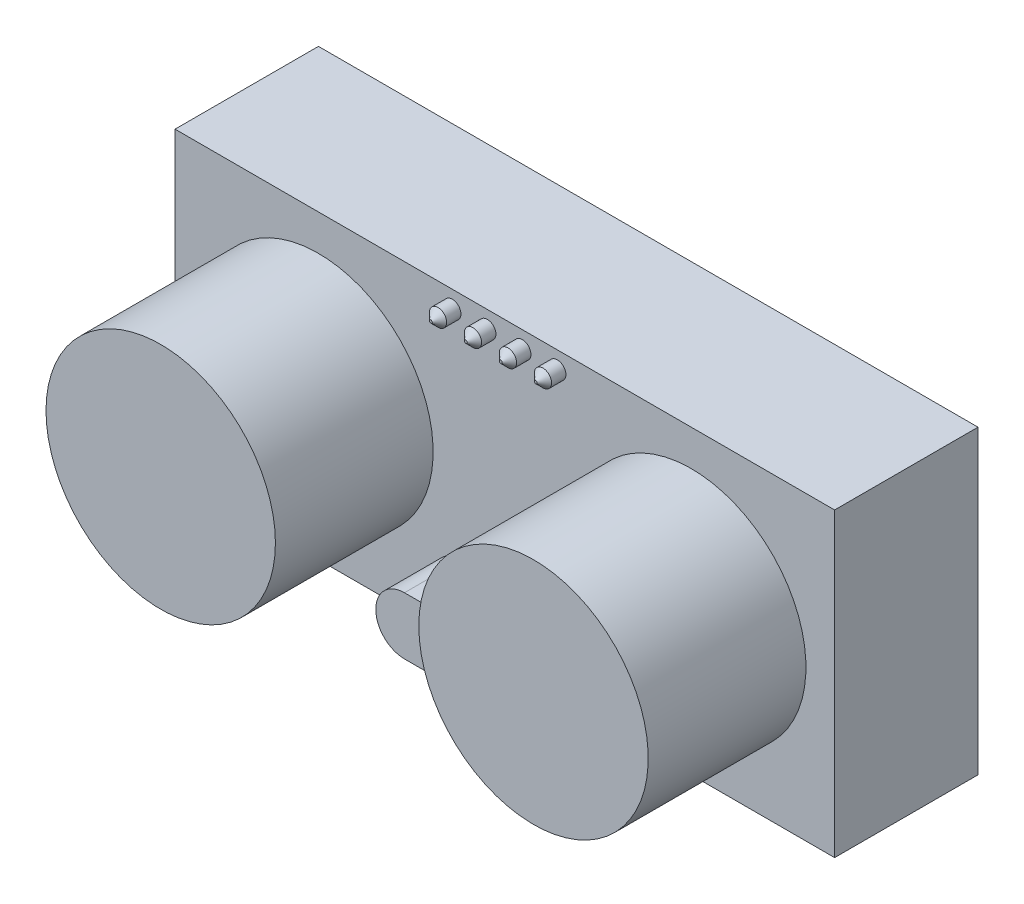
ISO-10303-21;
HEADER;
FILE_DESCRIPTION(('STEP AP214'),'2;1');
FILE_NAME('part.step','',(''),(''),'','','');
FILE_SCHEMA(('AUTOMOTIVE_DESIGN { 1 0 10303 214 1 1 1 1 }'));
ENDSEC;
DATA;
#1=APPLICATION_CONTEXT('core data for automotive mechanical design processes');
#2=APPLICATION_PROTOCOL_DEFINITION('international standard','automotive_design',2000,#1);
#3=PRODUCT_CONTEXT('',#1,'mechanical');
#4=PRODUCT('Part','Part','',(#3));
#5=PRODUCT_RELATED_PRODUCT_CATEGORY('part','',(#4));
#6=PRODUCT_DEFINITION_FORMATION('','',#4);
#7=PRODUCT_DEFINITION_CONTEXT('part definition',#1,'design');
#8=PRODUCT_DEFINITION('design','',#6,#7);
#9=PRODUCT_DEFINITION_SHAPE('','',#8);
#10=(LENGTH_UNIT() NAMED_UNIT(*) SI_UNIT(.MILLI.,.METRE.));
#11=(NAMED_UNIT(*) PLANE_ANGLE_UNIT() SI_UNIT($,.RADIAN.));
#12=(NAMED_UNIT(*) SI_UNIT($,.STERADIAN.) SOLID_ANGLE_UNIT());
#13=UNCERTAINTY_MEASURE_WITH_UNIT(LENGTH_MEASURE(1.E-05),#10,'distance_accuracy_value','');
#14=(GEOMETRIC_REPRESENTATION_CONTEXT(3) GLOBAL_UNCERTAINTY_ASSIGNED_CONTEXT((#13)) GLOBAL_UNIT_ASSIGNED_CONTEXT((#10,
#11,#12)) REPRESENTATION_CONTEXT('',''));
#15=CARTESIAN_POINT('',(0.,0.,0.));
#16=DIRECTION('',(0.,0.,1.));
#17=DIRECTION('',(1.,0.,0.));
#18=AXIS2_PLACEMENT_3D('',#15,#16,#17);
#19=CARTESIAN_POINT('',(0.,0.,10.));
#20=DIRECTION('',(0.,0.,-1.));
#21=DIRECTION('',(-1.,0.,0.));
#22=AXIS2_PLACEMENT_3D('',#19,#20,#21);
#23=PLANE('',#22);
#24=CARTESIAN_POINT('',(3.66,9.3,10.));
#25=DIRECTION('',(0.,0.,-1.));
#26=DIRECTION('',(-1.,0.,0.));
#27=AXIS2_PLACEMENT_3D('',#24,#25,#26);
#28=CIRCLE('',#27,0.6);
#29=CARTESIAN_POINT('',(3.06,9.3,10.));
#30=VERTEX_POINT('',#29);
#31=EDGE_CURVE('E172',#30,#30,#28,.F.);
#32=ORIENTED_EDGE('',*,*,#31,.F.);
#33=EDGE_LOOP('',(#32));
#34=FACE_BOUND('',#33,.T.);
#35=CARTESIAN_POINT('',(-3.66,9.29999999999999,10.));
#36=DIRECTION('',(0.,0.,-1.));
#37=DIRECTION('',(-1.,0.,0.));
#38=AXIS2_PLACEMENT_3D('',#35,#36,#37);
#39=CIRCLE('',#38,0.6);
#40=CARTESIAN_POINT('',(-4.26,9.29999999999999,10.));
#41=VERTEX_POINT('',#40);
#42=EDGE_CURVE('E166',#41,#41,#39,.F.);
#43=ORIENTED_EDGE('',*,*,#42,.F.);
#44=EDGE_LOOP('',(#43));
#45=FACE_BOUND('',#44,.T.);
#46=CARTESIAN_POINT('',(13.,0.,10.));
#47=DIRECTION('',(0.,0.,-1.));
#48=DIRECTION('',(-1.,0.,0.));
#49=AXIS2_PLACEMENT_3D('',#46,#47,#48);
#50=CIRCLE('',#49,8.);
#51=CARTESIAN_POINT('',(5.,0.,10.));
#52=VERTEX_POINT('',#51);
#53=EDGE_CURVE('E163',#52,#52,#50,.F.);
#54=ORIENTED_EDGE('',*,*,#53,.F.);
#55=EDGE_LOOP('',(#54));
#56=FACE_BOUND('',#55,.T.);
#57=DIRECTION('',(0.,1.,0.));
#58=VECTOR('',#57,1.);
#59=CARTESIAN_POINT('',(23.,-10.5,10.));
#60=LINE('',#59,#58);
#61=CARTESIAN_POINT('',(23.,-10.5,10.));
#62=VERTEX_POINT('',#61);
#63=CARTESIAN_POINT('',(23.,10.5,10.));
#64=VERTEX_POINT('',#63);
#65=EDGE_CURVE('E131',#62,#64,#60,.T.);
#66=ORIENTED_EDGE('',*,*,#65,.T.);
#67=DIRECTION('',(-1.,0.,0.));
#68=VECTOR('',#67,1.);
#69=CARTESIAN_POINT('',(-23.,10.5,10.));
#70=LINE('',#69,#68);
#71=CARTESIAN_POINT('',(-23.,10.5,10.));
#72=VERTEX_POINT('',#71);
#73=EDGE_CURVE('E134',#64,#72,#70,.T.);
#74=ORIENTED_EDGE('',*,*,#73,.T.);
#75=DIRECTION('',(0.,-1.,0.));
#76=VECTOR('',#75,1.);
#77=CARTESIAN_POINT('',(-23.,-10.5,10.));
#78=LINE('',#77,#76);
#79=CARTESIAN_POINT('',(-23.,-10.5,10.));
#80=VERTEX_POINT('',#79);
#81=EDGE_CURVE('E137',#72,#80,#78,.T.);
#82=ORIENTED_EDGE('',*,*,#81,.T.);
#83=DIRECTION('',(1.,0.,0.));
#84=VECTOR('',#83,1.);
#85=CARTESIAN_POINT('',(-23.,-10.5,10.));
#86=LINE('',#85,#84);
#87=EDGE_CURVE('E139',#80,#62,#86,.T.);
#88=ORIENTED_EDGE('',*,*,#87,.T.);
#89=EDGE_LOOP('',(#66,#74,#82,#88));
#90=FACE_BOUND('',#89,.T.);
#91=CARTESIAN_POINT('',(-13.,0.,10.));
#92=DIRECTION('',(0.,0.,-1.));
#93=DIRECTION('',(-1.,0.,0.));
#94=AXIS2_PLACEMENT_3D('',#91,#92,#93);
#95=CIRCLE('',#94,8.);
#96=CARTESIAN_POINT('',(-21.,0.,10.));
#97=VERTEX_POINT('',#96);
#98=EDGE_CURVE('E160',#97,#97,#95,.F.);
#99=ORIENTED_EDGE('',*,*,#98,.F.);
#100=EDGE_LOOP('',(#99));
#101=FACE_BOUND('',#100,.T.);
#102=CARTESIAN_POINT('',(-3.,-7.50000000000001,10.));
#103=DIRECTION('',(0.,0.,1.));
#104=DIRECTION('',(1.,0.,0.));
#105=AXIS2_PLACEMENT_3D('',#102,#103,#104);
#106=CIRCLE('',#105,2.);
#107=CARTESIAN_POINT('',(-3.,-5.50000000000001,10.));
#108=VERTEX_POINT('',#107);
#109=CARTESIAN_POINT('',(-3.,-9.50000000000001,10.));
#110=VERTEX_POINT('',#109);
#111=EDGE_CURVE('E118',#108,#110,#106,.T.);
#112=ORIENTED_EDGE('',*,*,#111,.F.);
#113=DIRECTION('',(-1.,0.,0.));
#114=VECTOR('',#113,1.);
#115=CARTESIAN_POINT('',(-3.,-5.50000000000001,10.));
#116=LINE('',#115,#114);
#117=CARTESIAN_POINT('',(3.,-5.50000000000001,10.));
#118=VERTEX_POINT('',#117);
#119=EDGE_CURVE('E115',#118,#108,#116,.T.);
#120=ORIENTED_EDGE('',*,*,#119,.F.);
#121=CARTESIAN_POINT('',(3.,-7.50000000000001,10.));
#122=DIRECTION('',(0.,0.,1.));
#123=DIRECTION('',(1.,0.,0.));
#124=AXIS2_PLACEMENT_3D('',#121,#122,#123);
#125=CIRCLE('',#124,2.);
#126=CARTESIAN_POINT('',(3.,-9.50000000000001,10.));
#127=VERTEX_POINT('',#126);
#128=EDGE_CURVE('E53',#127,#118,#125,.T.);
#129=ORIENTED_EDGE('',*,*,#128,.F.);
#130=DIRECTION('',(1.,0.,0.));
#131=VECTOR('',#130,1.);
#132=CARTESIAN_POINT('',(-3.,-9.50000000000001,10.));
#133=LINE('',#132,#131);
#134=EDGE_CURVE('E48',#110,#127,#133,.T.);
#135=ORIENTED_EDGE('',*,*,#134,.F.);
#136=EDGE_LOOP('',(#112,#120,#129,#135));
#137=FACE_BOUND('',#136,.T.);
#138=CARTESIAN_POINT('',(-1.22,9.29999999999999,10.));
#139=DIRECTION('',(0.,0.,-1.));
#140=DIRECTION('',(-1.,0.,0.));
#141=AXIS2_PLACEMENT_3D('',#138,#139,#140);
#142=CIRCLE('',#141,0.6);
#143=CARTESIAN_POINT('',(-1.82,9.29999999999999,10.));
#144=VERTEX_POINT('',#143);
#145=EDGE_CURVE('E169',#144,#144,#142,.F.);
#146=ORIENTED_EDGE('',*,*,#145,.F.);
#147=EDGE_LOOP('',(#146));
#148=FACE_BOUND('',#147,.T.);
#149=CARTESIAN_POINT('',(1.22,9.29999999999999,10.));
#150=DIRECTION('',(0.,0.,-1.));
#151=DIRECTION('',(-1.,0.,0.));
#152=AXIS2_PLACEMENT_3D('',#149,#150,#151);
#153=CIRCLE('',#152,0.6);
#154=CARTESIAN_POINT('',(0.62,9.29999999999999,10.));
#155=VERTEX_POINT('',#154);
#156=EDGE_CURVE('E175',#155,#155,#153,.F.);
#157=ORIENTED_EDGE('',*,*,#156,.F.);
#158=EDGE_LOOP('',(#157));
#159=FACE_BOUND('',#158,.T.);
#160=ADVANCED_FACE('F33',(#34,#45,#56,#90,#101,#137,#148,#159),#23,.F.);
#161=CARTESIAN_POINT('',(23.,-10.5,10.));
#162=DIRECTION('',(-1.,0.,0.));
#163=DIRECTION('',(0.,0.,1.));
#164=AXIS2_PLACEMENT_3D('',#161,#162,#163);
#165=PLANE('',#164);
#166=DIRECTION('',(0.,1.,0.));
#167=VECTOR('',#166,1.);
#168=CARTESIAN_POINT('',(23.,-10.5,0.));
#169=LINE('',#168,#167);
#170=CARTESIAN_POINT('',(23.,-10.5,0.));
#171=VERTEX_POINT('',#170);
#172=CARTESIAN_POINT('',(23.,10.5,0.));
#173=VERTEX_POINT('',#172);
#174=EDGE_CURVE('E130',#171,#173,#169,.T.);
#175=ORIENTED_EDGE('',*,*,#174,.T.);
#176=DIRECTION('',(0.,0.,-1.));
#177=VECTOR('',#176,1.);
#178=CARTESIAN_POINT('',(23.,10.5,10.));
#179=LINE('',#178,#177);
#180=EDGE_CURVE('E157',#64,#173,#179,.T.);
#181=ORIENTED_EDGE('',*,*,#180,.F.);
#182=ORIENTED_EDGE('',*,*,#65,.F.);
#183=DIRECTION('',(0.,0.,-1.));
#184=VECTOR('',#183,1.);
#185=CARTESIAN_POINT('',(23.,-10.5,10.));
#186=LINE('',#185,#184);
#187=EDGE_CURVE('E141',#62,#171,#186,.T.);
#188=ORIENTED_EDGE('',*,*,#187,.T.);
#189=EDGE_LOOP('',(#175,#181,#182,#188));
#190=FACE_BOUND('',#189,.T.);
#191=ADVANCED_FACE('F210',(#190),#165,.F.);
#192=CARTESIAN_POINT('',(-23.,10.5,10.));
#193=DIRECTION('',(0.,-1.,0.));
#194=DIRECTION('',(0.,0.,-1.));
#195=AXIS2_PLACEMENT_3D('',#192,#193,#194);
#196=PLANE('',#195);
#197=DIRECTION('',(-1.,0.,0.));
#198=VECTOR('',#197,1.);
#199=CARTESIAN_POINT('',(-23.,10.5,0.));
#200=LINE('',#199,#198);
#201=CARTESIAN_POINT('',(-23.,10.5,0.));
#202=VERTEX_POINT('',#201);
#203=EDGE_CURVE('E144',#173,#202,#200,.T.);
#204=ORIENTED_EDGE('',*,*,#203,.T.);
#205=DIRECTION('',(0.,0.,-1.));
#206=VECTOR('',#205,1.);
#207=CARTESIAN_POINT('',(-23.,10.5,10.));
#208=LINE('',#207,#206);
#209=EDGE_CURVE('E154',#72,#202,#208,.T.);
#210=ORIENTED_EDGE('',*,*,#209,.F.);
#211=ORIENTED_EDGE('',*,*,#73,.F.);
#212=ORIENTED_EDGE('',*,*,#180,.T.);
#213=EDGE_LOOP('',(#204,#210,#211,#212));
#214=FACE_BOUND('',#213,.T.);
#215=ADVANCED_FACE('F216',(#214),#196,.F.);
#216=CARTESIAN_POINT('',(-23.,-10.5,10.));
#217=DIRECTION('',(1.,0.,0.));
#218=DIRECTION('',(0.,0.,-1.));
#219=AXIS2_PLACEMENT_3D('',#216,#217,#218);
#220=PLANE('',#219);
#221=DIRECTION('',(0.,-1.,0.));
#222=VECTOR('',#221,1.);
#223=CARTESIAN_POINT('',(-23.,-10.5,0.));
#224=LINE('',#223,#222);
#225=CARTESIAN_POINT('',(-23.,-10.5,0.));
#226=VERTEX_POINT('',#225);
#227=EDGE_CURVE('E146',#202,#226,#224,.T.);
#228=ORIENTED_EDGE('',*,*,#227,.T.);
#229=DIRECTION('',(0.,0.,-1.));
#230=VECTOR('',#229,1.);
#231=CARTESIAN_POINT('',(-23.,-10.5,10.));
#232=LINE('',#231,#230);
#233=EDGE_CURVE('E151',#80,#226,#232,.T.);
#234=ORIENTED_EDGE('',*,*,#233,.F.);
#235=ORIENTED_EDGE('',*,*,#81,.F.);
#236=ORIENTED_EDGE('',*,*,#209,.T.);
#237=EDGE_LOOP('',(#228,#234,#235,#236));
#238=FACE_BOUND('',#237,.T.);
#239=ADVANCED_FACE('F232',(#238),#220,.F.);
#240=CARTESIAN_POINT('',(-23.,-10.5,10.));
#241=DIRECTION('',(0.,1.,0.));
#242=DIRECTION('',(0.,0.,1.));
#243=AXIS2_PLACEMENT_3D('',#240,#241,#242);
#244=PLANE('',#243);
#245=DIRECTION('',(1.,0.,0.));
#246=VECTOR('',#245,1.);
#247=CARTESIAN_POINT('',(-23.,-10.5,0.));
#248=LINE('',#247,#246);
#249=EDGE_CURVE('E135',#226,#171,#248,.T.);
#250=ORIENTED_EDGE('',*,*,#249,.T.);
#251=ORIENTED_EDGE('',*,*,#187,.F.);
#252=ORIENTED_EDGE('',*,*,#87,.F.);
#253=ORIENTED_EDGE('',*,*,#233,.T.);
#254=EDGE_LOOP('',(#250,#251,#252,#253));
#255=FACE_BOUND('',#254,.T.);
#256=ADVANCED_FACE('F228',(#255),#244,.F.);
#257=CARTESIAN_POINT('',(0.,0.,0.));
#258=DIRECTION('',(0.,0.,-1.));
#259=DIRECTION('',(-1.,0.,0.));
#260=AXIS2_PLACEMENT_3D('',#257,#258,#259);
#261=PLANE('',#260);
#262=ORIENTED_EDGE('',*,*,#174,.F.);
#263=ORIENTED_EDGE('',*,*,#249,.F.);
#264=ORIENTED_EDGE('',*,*,#227,.F.);
#265=ORIENTED_EDGE('',*,*,#203,.F.);
#266=EDGE_LOOP('',(#262,#263,#264,#265));
#267=FACE_BOUND('',#266,.T.);
#268=ADVANCED_FACE('F225',(#267),#261,.T.);
#269=CARTESIAN_POINT('',(-13.,0.,21.));
#270=DIRECTION('',(0.,0.,-1.));
#271=DIRECTION('',(-1.,0.,0.));
#272=AXIS2_PLACEMENT_3D('',#269,#270,#271);
#273=CYLINDRICAL_SURFACE('',#272,8.);
#274=CARTESIAN_POINT('',(-13.,0.,21.));
#275=DIRECTION('',(0.,0.,1.));
#276=DIRECTION('',(1.,0.,0.));
#277=AXIS2_PLACEMENT_3D('',#274,#275,#276);
#278=CIRCLE('',#277,8.);
#279=CARTESIAN_POINT('',(-5.,0.,21.));
#280=VERTEX_POINT('',#279);
#281=EDGE_CURVE('E122',#280,#280,#278,.T.);
#282=ORIENTED_EDGE('',*,*,#281,.F.);
#283=EDGE_LOOP('',(#282));
#284=FACE_BOUND('',#283,.T.);
#285=ORIENTED_EDGE('',*,*,#98,.T.);
#286=EDGE_LOOP('',(#285));
#287=FACE_BOUND('',#286,.T.);
#288=ADVANCED_FACE('F223',(#284,#287),#273,.T.);
#289=CARTESIAN_POINT('',(-13.,0.,21.));
#290=DIRECTION('',(0.,0.,1.));
#291=DIRECTION('',(1.,0.,0.));
#292=AXIS2_PLACEMENT_3D('',#289,#290,#291);
#293=PLANE('',#292);
#294=ORIENTED_EDGE('',*,*,#281,.T.);
#295=EDGE_LOOP('',(#294));
#296=FACE_BOUND('',#295,.T.);
#297=ADVANCED_FACE('F296',(#296),#293,.T.);
#298=CARTESIAN_POINT('',(13.,0.,21.));
#299=DIRECTION('',(0.,0.,-1.));
#300=DIRECTION('',(-1.,0.,0.));
#301=AXIS2_PLACEMENT_3D('',#298,#299,#300);
#302=CYLINDRICAL_SURFACE('',#301,8.);
#303=CARTESIAN_POINT('',(13.,0.,21.));
#304=DIRECTION('',(0.,0.,1.));
#305=DIRECTION('',(-1.,0.,0.));
#306=AXIS2_PLACEMENT_3D('',#303,#304,#305);
#307=CIRCLE('',#306,8.);
#308=CARTESIAN_POINT('',(5.,0.,21.));
#309=VERTEX_POINT('',#308);
#310=EDGE_CURVE('E119',#309,#309,#307,.T.);
#311=ORIENTED_EDGE('',*,*,#310,.F.);
#312=EDGE_LOOP('',(#311));
#313=FACE_BOUND('',#312,.T.);
#314=ORIENTED_EDGE('',*,*,#53,.T.);
#315=EDGE_LOOP('',(#314));
#316=FACE_BOUND('',#315,.T.);
#317=ADVANCED_FACE('F293',(#313,#316),#302,.T.);
#318=CARTESIAN_POINT('',(13.,0.,21.));
#319=DIRECTION('',(0.,0.,-1.));
#320=DIRECTION('',(-1.,0.,0.));
#321=AXIS2_PLACEMENT_3D('',#318,#319,#320);
#322=PLANE('',#321);
#323=ORIENTED_EDGE('',*,*,#310,.T.);
#324=EDGE_LOOP('',(#323));
#325=FACE_BOUND('',#324,.T.);
#326=ADVANCED_FACE('F290',(#325),#322,.F.);
#327=CARTESIAN_POINT('',(-3.,-7.50000000000001,14.));
#328=DIRECTION('',(0.,0.,-1.));
#329=DIRECTION('',(-1.,0.,0.));
#330=AXIS2_PLACEMENT_3D('',#327,#328,#329);
#331=CYLINDRICAL_SURFACE('',#330,2.);
#332=ORIENTED_EDGE('',*,*,#111,.T.);
#333=DIRECTION('',(0.,0.,-1.));
#334=VECTOR('',#333,1.);
#335=CARTESIAN_POINT('',(-3.,-9.50000000000001,14.));
#336=LINE('',#335,#334);
#337=CARTESIAN_POINT('',(-3.,-9.50000000000001,14.));
#338=VERTEX_POINT('',#337);
#339=EDGE_CURVE('E99',#338,#110,#336,.T.);
#340=ORIENTED_EDGE('',*,*,#339,.F.);
#341=CARTESIAN_POINT('',(-3.,-7.50000000000001,14.));
#342=DIRECTION('',(0.,0.,1.));
#343=DIRECTION('',(1.,0.,0.));
#344=AXIS2_PLACEMENT_3D('',#341,#342,#343);
#345=CIRCLE('',#344,2.);
#346=CARTESIAN_POINT('',(-3.,-5.50000000000001,14.));
#347=VERTEX_POINT('',#346);
#348=EDGE_CURVE('E106',#347,#338,#345,.T.);
#349=ORIENTED_EDGE('',*,*,#348,.F.);
#350=DIRECTION('',(0.,0.,-1.));
#351=VECTOR('',#350,1.);
#352=CARTESIAN_POINT('',(-3.,-5.50000000000001,14.));
#353=LINE('',#352,#351);
#354=EDGE_CURVE('E480',#347,#108,#353,.T.);
#355=ORIENTED_EDGE('',*,*,#354,.T.);
#356=EDGE_LOOP('',(#332,#340,#349,#355));
#357=FACE_BOUND('',#356,.T.);
#358=ADVANCED_FACE('F117',(#357),#331,.T.);
#359=CARTESIAN_POINT('',(-3.,-9.50000000000001,14.));
#360=DIRECTION('',(0.,1.,0.));
#361=DIRECTION('',(0.,0.,1.));
#362=AXIS2_PLACEMENT_3D('',#359,#360,#361);
#363=PLANE('',#362);
#364=ORIENTED_EDGE('',*,*,#134,.T.);
#365=DIRECTION('',(0.,0.,-1.));
#366=VECTOR('',#365,1.);
#367=CARTESIAN_POINT('',(3.,-9.50000000000001,14.));
#368=LINE('',#367,#366);
#369=CARTESIAN_POINT('',(3.,-9.50000000000001,14.));
#370=VERTEX_POINT('',#369);
#371=EDGE_CURVE('E102',#370,#127,#368,.T.);
#372=ORIENTED_EDGE('',*,*,#371,.F.);
#373=DIRECTION('',(1.,0.,0.));
#374=VECTOR('',#373,1.);
#375=CARTESIAN_POINT('',(-3.,-9.50000000000001,14.));
#376=LINE('',#375,#374);
#377=EDGE_CURVE('E95',#338,#370,#376,.T.);
#378=ORIENTED_EDGE('',*,*,#377,.F.);
#379=ORIENTED_EDGE('',*,*,#339,.T.);
#380=EDGE_LOOP('',(#364,#372,#378,#379));
#381=FACE_BOUND('',#380,.T.);
#382=ADVANCED_FACE('F97',(#381),#363,.F.);
#383=CARTESIAN_POINT('',(3.,-7.50000000000001,14.));
#384=DIRECTION('',(0.,0.,-1.));
#385=DIRECTION('',(-1.,0.,0.));
#386=AXIS2_PLACEMENT_3D('',#383,#384,#385);
#387=CYLINDRICAL_SURFACE('',#386,2.);
#388=ORIENTED_EDGE('',*,*,#128,.T.);
#389=DIRECTION('',(0.,0.,-1.));
#390=VECTOR('',#389,1.);
#391=CARTESIAN_POINT('',(3.,-5.50000000000001,14.));
#392=LINE('',#391,#390);
#393=CARTESIAN_POINT('',(3.,-5.50000000000001,14.));
#394=VERTEX_POINT('',#393);
#395=EDGE_CURVE('E124',#394,#118,#392,.T.);
#396=ORIENTED_EDGE('',*,*,#395,.F.);
#397=CARTESIAN_POINT('',(3.,-7.50000000000001,14.));
#398=DIRECTION('',(0.,0.,1.));
#399=DIRECTION('',(1.,0.,0.));
#400=AXIS2_PLACEMENT_3D('',#397,#398,#399);
#401=CIRCLE('',#400,2.);
#402=EDGE_CURVE('E105',#370,#394,#401,.T.);
#403=ORIENTED_EDGE('',*,*,#402,.F.);
#404=ORIENTED_EDGE('',*,*,#371,.T.);
#405=EDGE_LOOP('',(#388,#396,#403,#404));
#406=FACE_BOUND('',#405,.T.);
#407=ADVANCED_FACE('F281',(#406),#387,.T.);
#408=CARTESIAN_POINT('',(-3.,-5.50000000000001,14.));
#409=DIRECTION('',(0.,-1.,0.));
#410=DIRECTION('',(0.,0.,-1.));
#411=AXIS2_PLACEMENT_3D('',#408,#409,#410);
#412=PLANE('',#411);
#413=ORIENTED_EDGE('',*,*,#119,.T.);
#414=ORIENTED_EDGE('',*,*,#354,.F.);
#415=DIRECTION('',(-1.,0.,0.));
#416=VECTOR('',#415,1.);
#417=CARTESIAN_POINT('',(-3.,-5.50000000000001,14.));
#418=LINE('',#417,#416);
#419=EDGE_CURVE('E111',#394,#347,#418,.T.);
#420=ORIENTED_EDGE('',*,*,#419,.F.);
#421=ORIENTED_EDGE('',*,*,#395,.T.);
#422=EDGE_LOOP('',(#413,#414,#420,#421));
#423=FACE_BOUND('',#422,.T.);
#424=ADVANCED_FACE('F278',(#423),#412,.F.);
#425=CARTESIAN_POINT('',(-3.,-7.50000000000001,14.));
#426=DIRECTION('',(0.,0.,1.));
#427=DIRECTION('',(1.,0.,0.));
#428=AXIS2_PLACEMENT_3D('',#425,#426,#427);
#429=PLANE('',#428);
#430=ORIENTED_EDGE('',*,*,#348,.T.);
#431=ORIENTED_EDGE('',*,*,#377,.T.);
#432=ORIENTED_EDGE('',*,*,#402,.T.);
#433=ORIENTED_EDGE('',*,*,#419,.T.);
#434=EDGE_LOOP('',(#430,#431,#432,#433));
#435=FACE_BOUND('',#434,.T.);
#436=ADVANCED_FACE('F109',(#435),#429,.T.);
#437=CARTESIAN_POINT('',(-3.66,9.29999999999999,11.5));
#438=DIRECTION('',(0.,0.,-1.));
#439=DIRECTION('',(-1.,0.,0.));
#440=AXIS2_PLACEMENT_3D('',#437,#438,#439);
#441=CYLINDRICAL_SURFACE('',#440,0.6);
#442=CARTESIAN_POINT('',(-3.66,9.29999999999999,11.));
#443=DIRECTION('',(0.,0.,1.));
#444=DIRECTION('',(1.,0.,0.));
#445=AXIS2_PLACEMENT_3D('',#442,#443,#444);
#446=CIRCLE('',#445,0.6);
#447=CARTESIAN_POINT('',(-4.26,9.29999999999999,11.));
#448=VERTEX_POINT('',#447);
#449=EDGE_CURVE('E181',#448,#448,#446,.F.);
#450=ORIENTED_EDGE('',*,*,#449,.T.);
#451=EDGE_LOOP('',(#450));
#452=FACE_BOUND('',#451,.T.);
#453=ORIENTED_EDGE('',*,*,#42,.T.);
#454=EDGE_LOOP('',(#453));
#455=FACE_BOUND('',#454,.T.);
#456=ADVANCED_FACE('F271',(#452,#455),#441,.T.);
#457=CARTESIAN_POINT('',(-3.66,9.29999999999999,11.5));
#458=DIRECTION('',(0.,0.,1.));
#459=DIRECTION('',(1.,0.,0.));
#460=AXIS2_PLACEMENT_3D('',#457,#458,#459);
#461=PLANE('',#460);
#462=CARTESIAN_POINT('',(-3.66,9.29999999999999,11.5));
#463=DIRECTION('',(0.,0.,1.));
#464=DIRECTION('',(1.,0.,0.));
#465=AXIS2_PLACEMENT_3D('',#462,#463,#464);
#466=CIRCLE('',#465,0.100000000000003);
#467=CARTESIAN_POINT('',(-3.76,9.29999999999999,11.5));
#468=VERTEX_POINT('',#467);
#469=EDGE_CURVE('E178',#468,#468,#466,.T.);
#470=ORIENTED_EDGE('',*,*,#469,.T.);
#471=EDGE_LOOP('',(#470));
#472=FACE_BOUND('',#471,.T.);
#473=ADVANCED_FACE('F264',(#472),#461,.T.);
#474=CARTESIAN_POINT('',(-1.22,9.29999999999999,11.5));
#475=DIRECTION('',(0.,0.,-1.));
#476=DIRECTION('',(-1.,0.,0.));
#477=AXIS2_PLACEMENT_3D('',#474,#475,#476);
#478=CYLINDRICAL_SURFACE('',#477,0.6);
#479=CARTESIAN_POINT('',(-1.22,9.29999999999999,11.));
#480=DIRECTION('',(0.,0.,1.));
#481=DIRECTION('',(1.,0.,0.));
#482=AXIS2_PLACEMENT_3D('',#479,#480,#481);
#483=CIRCLE('',#482,0.6);
#484=CARTESIAN_POINT('',(-1.82,9.29999999999999,11.));
#485=VERTEX_POINT('',#484);
#486=EDGE_CURVE('E187',#485,#485,#483,.F.);
#487=ORIENTED_EDGE('',*,*,#486,.T.);
#488=EDGE_LOOP('',(#487));
#489=FACE_BOUND('',#488,.T.);
#490=ORIENTED_EDGE('',*,*,#145,.T.);
#491=EDGE_LOOP('',(#490));
#492=FACE_BOUND('',#491,.T.);
#493=ADVANCED_FACE('F256',(#489,#492),#478,.T.);
#494=CARTESIAN_POINT('',(-1.22,9.29999999999999,11.5));
#495=DIRECTION('',(0.,0.,1.));
#496=DIRECTION('',(1.,0.,0.));
#497=AXIS2_PLACEMENT_3D('',#494,#495,#496);
#498=PLANE('',#497);
#499=CARTESIAN_POINT('',(-1.22,9.29999999999999,11.5));
#500=DIRECTION('',(0.,0.,1.));
#501=DIRECTION('',(1.,0.,0.));
#502=AXIS2_PLACEMENT_3D('',#499,#500,#501);
#503=CIRCLE('',#502,0.100000000000003);
#504=CARTESIAN_POINT('',(-1.32,9.29999999999999,11.5));
#505=VERTEX_POINT('',#504);
#506=EDGE_CURVE('E184',#505,#505,#503,.T.);
#507=ORIENTED_EDGE('',*,*,#506,.T.);
#508=EDGE_LOOP('',(#507));
#509=FACE_BOUND('',#508,.T.);
#510=ADVANCED_FACE('F253',(#509),#498,.T.);
#511=CARTESIAN_POINT('',(3.66,9.3,11.5));
#512=DIRECTION('',(0.,0.,-1.));
#513=DIRECTION('',(-1.,0.,0.));
#514=AXIS2_PLACEMENT_3D('',#511,#512,#513);
#515=CYLINDRICAL_SURFACE('',#514,0.6);
#516=CARTESIAN_POINT('',(3.66,9.3,11.));
#517=DIRECTION('',(0.,0.,-1.));
#518=DIRECTION('',(-1.,0.,0.));
#519=AXIS2_PLACEMENT_3D('',#516,#517,#518);
#520=CIRCLE('',#519,0.6);
#521=CARTESIAN_POINT('',(3.06,9.3,11.));
#522=VERTEX_POINT('',#521);
#523=EDGE_CURVE('E11',#522,#522,#520,.T.);
#524=ORIENTED_EDGE('',*,*,#523,.T.);
#525=EDGE_LOOP('',(#524));
#526=FACE_BOUND('',#525,.T.);
#527=ORIENTED_EDGE('',*,*,#31,.T.);
#528=EDGE_LOOP('',(#527));
#529=FACE_BOUND('',#528,.T.);
#530=ADVANCED_FACE('F255',(#526,#529),#515,.T.);
#531=CARTESIAN_POINT('',(3.66,9.3,11.5));
#532=DIRECTION('',(0.,0.,-1.));
#533=DIRECTION('',(-1.,0.,0.));
#534=AXIS2_PLACEMENT_3D('',#531,#532,#533);
#535=PLANE('',#534);
#536=CARTESIAN_POINT('',(3.66,9.3,11.5));
#537=DIRECTION('',(0.,0.,-1.));
#538=DIRECTION('',(-1.,0.,0.));
#539=AXIS2_PLACEMENT_3D('',#536,#537,#538);
#540=CIRCLE('',#539,0.100000000000003);
#541=CARTESIAN_POINT('',(3.56,9.3,11.5));
#542=VERTEX_POINT('',#541);
#543=EDGE_CURVE('E41',#542,#542,#540,.F.);
#544=ORIENTED_EDGE('',*,*,#543,.T.);
#545=EDGE_LOOP('',(#544));
#546=FACE_BOUND('',#545,.T.);
#547=ADVANCED_FACE('F198',(#546),#535,.F.);
#548=CARTESIAN_POINT('',(1.22,9.29999999999999,11.5));
#549=DIRECTION('',(0.,0.,-1.));
#550=DIRECTION('',(-1.,0.,0.));
#551=AXIS2_PLACEMENT_3D('',#548,#549,#550);
#552=CYLINDRICAL_SURFACE('',#551,0.6);
#553=CARTESIAN_POINT('',(1.22,9.29999999999999,11.));
#554=DIRECTION('',(0.,0.,-1.));
#555=DIRECTION('',(-1.,0.,0.));
#556=AXIS2_PLACEMENT_3D('',#553,#554,#555);
#557=CIRCLE('',#556,0.6);
#558=CARTESIAN_POINT('',(0.620000000000001,9.29999999999999,11.));
#559=VERTEX_POINT('',#558);
#560=EDGE_CURVE('E193',#559,#559,#557,.T.);
#561=ORIENTED_EDGE('',*,*,#560,.T.);
#562=EDGE_LOOP('',(#561));
#563=FACE_BOUND('',#562,.T.);
#564=ORIENTED_EDGE('',*,*,#156,.T.);
#565=EDGE_LOOP('',(#564));
#566=FACE_BOUND('',#565,.T.);
#567=ADVANCED_FACE('F314',(#563,#566),#552,.T.);
#568=CARTESIAN_POINT('',(1.22,9.29999999999999,11.5));
#569=DIRECTION('',(0.,0.,-1.));
#570=DIRECTION('',(-1.,0.,0.));
#571=AXIS2_PLACEMENT_3D('',#568,#569,#570);
#572=PLANE('',#571);
#573=CARTESIAN_POINT('',(1.22,9.29999999999999,11.5));
#574=DIRECTION('',(0.,0.,-1.));
#575=DIRECTION('',(-1.,0.,0.));
#576=AXIS2_PLACEMENT_3D('',#573,#574,#575);
#577=CIRCLE('',#576,0.100000000000003);
#578=CARTESIAN_POINT('',(1.12,9.29999999999999,11.5));
#579=VERTEX_POINT('',#578);
#580=EDGE_CURVE('E190',#579,#579,#577,.F.);
#581=ORIENTED_EDGE('',*,*,#580,.T.);
#582=EDGE_LOOP('',(#581));
#583=FACE_BOUND('',#582,.T.);
#584=ADVANCED_FACE('F243',(#583),#572,.F.);
#585=CARTESIAN_POINT('',(-3.66,9.29999999999999,11.5));
#586=DIRECTION('',(0.,0.,-1.));
#587=DIRECTION('',(-1.,0.,0.));
#588=AXIS2_PLACEMENT_3D('',#585,#586,#587);
#589=CONICAL_SURFACE('',#588,0.100000000000003,0.785398163397446);
#590=CARTESIAN_POINT('',(-4.26,9.29999999999999,11.));
#591=CARTESIAN_POINT('',(-4.25479166666667,9.29999999999999,11.0052083333333));
#592=CARTESIAN_POINT('',(-4.24958333333333,9.29999999999999,11.0104166666667));
#593=CARTESIAN_POINT('',(-4.23916666666667,9.29999999999999,11.0208333333333));
#594=CARTESIAN_POINT('',(-4.23395833333334,9.29999999999999,11.0260416666667));
#595=CARTESIAN_POINT('',(-4.22354166666667,9.29999999999999,11.0364583333333));
#596=CARTESIAN_POINT('',(-4.21833333333334,9.29999999999999,11.0416666666667));
#597=CARTESIAN_POINT('',(-4.20791666666667,9.29999999999999,11.0520833333333));
#598=CARTESIAN_POINT('',(-4.20270833333334,9.29999999999999,11.0572916666667));
#599=CARTESIAN_POINT('',(-4.19229166666667,9.29999999999999,11.0677083333333));
#600=CARTESIAN_POINT('',(-4.18708333333334,9.29999999999999,11.0729166666667));
#601=CARTESIAN_POINT('',(-4.17666666666667,9.29999999999999,11.0833333333333));
#602=CARTESIAN_POINT('',(-4.17145833333334,9.29999999999999,11.0885416666667));
#603=CARTESIAN_POINT('',(-4.16104166666667,9.29999999999999,11.0989583333333));
#604=CARTESIAN_POINT('',(-4.15583333333334,9.29999999999999,11.1041666666667));
#605=CARTESIAN_POINT('',(-4.14541666666667,9.29999999999999,11.1145833333333));
#606=CARTESIAN_POINT('',(-4.14020833333334,9.29999999999999,11.1197916666667));
#607=CARTESIAN_POINT('',(-4.12979166666667,9.29999999999999,11.1302083333333));
#608=CARTESIAN_POINT('',(-4.12458333333334,9.29999999999999,11.1354166666667));
#609=CARTESIAN_POINT('',(-4.11416666666667,9.29999999999999,11.1458333333333));
#610=CARTESIAN_POINT('',(-4.10895833333334,9.29999999999999,11.1510416666667));
#611=CARTESIAN_POINT('',(-4.09854166666667,9.29999999999999,11.1614583333333));
#612=CARTESIAN_POINT('',(-4.09333333333334,9.29999999999999,11.1666666666667));
#613=CARTESIAN_POINT('',(-4.08291666666667,9.29999999999999,11.1770833333333));
#614=CARTESIAN_POINT('',(-4.07770833333334,9.29999999999999,11.1822916666667));
#615=CARTESIAN_POINT('',(-4.06729166666667,9.29999999999999,11.1927083333333));
#616=CARTESIAN_POINT('',(-4.06208333333334,9.29999999999999,11.1979166666667));
#617=CARTESIAN_POINT('',(-4.05166666666667,9.29999999999999,11.2083333333333));
#618=CARTESIAN_POINT('',(-4.04645833333334,9.29999999999999,11.2135416666667));
#619=CARTESIAN_POINT('',(-4.03604166666667,9.29999999999999,11.2239583333333));
#620=CARTESIAN_POINT('',(-4.03083333333334,9.29999999999999,11.2291666666667));
#621=CARTESIAN_POINT('',(-4.02041666666667,9.29999999999999,11.2395833333333));
#622=CARTESIAN_POINT('',(-4.01520833333334,9.29999999999999,11.2447916666667));
#623=CARTESIAN_POINT('',(-4.00479166666667,9.29999999999999,11.2552083333333));
#624=CARTESIAN_POINT('',(-3.99958333333334,9.29999999999999,11.2604166666667));
#625=CARTESIAN_POINT('',(-3.98916666666667,9.29999999999999,11.2708333333333));
#626=CARTESIAN_POINT('',(-3.98395833333334,9.29999999999999,11.2760416666667));
#627=CARTESIAN_POINT('',(-3.97354166666667,9.29999999999999,11.2864583333333));
#628=CARTESIAN_POINT('',(-3.96833333333334,9.29999999999999,11.2916666666667));
#629=CARTESIAN_POINT('',(-3.95791666666667,9.29999999999999,11.3020833333333));
#630=CARTESIAN_POINT('',(-3.95270833333334,9.29999999999999,11.3072916666667));
#631=CARTESIAN_POINT('',(-3.94229166666667,9.29999999999999,11.3177083333333));
#632=CARTESIAN_POINT('',(-3.93708333333334,9.29999999999999,11.3229166666667));
#633=CARTESIAN_POINT('',(-3.92666666666667,9.29999999999999,11.3333333333333));
#634=CARTESIAN_POINT('',(-3.92145833333334,9.29999999999999,11.3385416666667));
#635=CARTESIAN_POINT('',(-3.91104166666667,9.29999999999999,11.3489583333333));
#636=CARTESIAN_POINT('',(-3.90583333333334,9.29999999999999,11.3541666666667));
#637=CARTESIAN_POINT('',(-3.89541666666667,9.29999999999999,11.3645833333333));
#638=CARTESIAN_POINT('',(-3.89020833333334,9.29999999999999,11.3697916666667));
#639=CARTESIAN_POINT('',(-3.87979166666667,9.29999999999999,11.3802083333333));
#640=CARTESIAN_POINT('',(-3.87458333333334,9.29999999999999,11.3854166666667));
#641=CARTESIAN_POINT('',(-3.86416666666667,9.29999999999999,11.3958333333333));
#642=CARTESIAN_POINT('',(-3.85895833333334,9.29999999999999,11.4010416666667));
#643=CARTESIAN_POINT('',(-3.84854166666667,9.29999999999999,11.4114583333333));
#644=CARTESIAN_POINT('',(-3.84333333333334,9.29999999999999,11.4166666666667));
#645=CARTESIAN_POINT('',(-3.83291666666667,9.29999999999999,11.4270833333333));
#646=CARTESIAN_POINT('',(-3.82770833333334,9.29999999999999,11.4322916666667));
#647=CARTESIAN_POINT('',(-3.81729166666667,9.29999999999999,11.4427083333333));
#648=CARTESIAN_POINT('',(-3.81208333333334,9.29999999999999,11.4479166666667));
#649=CARTESIAN_POINT('',(-3.80166666666667,9.29999999999999,11.4583333333333));
#650=CARTESIAN_POINT('',(-3.79645833333334,9.29999999999999,11.4635416666667));
#651=CARTESIAN_POINT('',(-3.78604166666667,9.29999999999999,11.4739583333333));
#652=CARTESIAN_POINT('',(-3.78083333333334,9.29999999999999,11.4791666666667));
#653=CARTESIAN_POINT('',(-3.77041666666667,9.29999999999999,11.4895833333333));
#654=CARTESIAN_POINT('',(-3.76520833333334,9.29999999999999,11.4947916666667));
#655=CARTESIAN_POINT('',(-3.76,9.29999999999999,11.5));
#656=B_SPLINE_CURVE_WITH_KNOTS('',3,(#590,#591,#592,#593,#594,#595,#596,#597,#598,#599,#600,
#601,#602,#603,#604,#605,#606,#607,#608,#609,#610,#611,#612,#613,#614,#615,#616,#617,#618,#619,
#620,#621,#622,#623,#624,#625,#626,#627,#628,#629,#630,#631,#632,#633,#634,#635,#636,#637,#638,
#639,#640,#641,#642,#643,#644,#645,#646,#647,#648,#649,#650,#651,#652,#653,#654,#655),
.UNSPECIFIED.,.F.,.F.,(4,2,2,2,2,2,2,2,2,2,2,2,2,2,2,2,2,2,2,2,2,2,2,2,2,2,2,2,2,2,2,2,4),(0.,
0.022097086912079,0.0441941738241586,0.0662912607362383,0.0883883476483179,0.110485434560398,
0.132582521472477,0.154679608384557,0.176776695296636,0.198873782208716,0.220970869120795,
0.243067956032875,0.265165042944954,0.287262129857034,0.309359216769114,0.331456303681193,
0.353553390593273,0.375650477505352,0.397747564417432,0.419844651329511,0.441941738241591,
0.464038825153671,0.48613591206575,0.508232998977829,0.530330085889909,0.552427172801989,
0.574524259714068,0.596621346626148,0.618718433538227,0.640815520450307,0.662912607362387,
0.685009694274466,0.707106781186546),.UNSPECIFIED.);
#657=EDGE_CURVE('BSEAM240',#448,#468,#656,.T.);
#658=ORIENTED_EDGE('',*,*,#449,.F.);
#659=ORIENTED_EDGE('',*,*,#469,.F.);
#660=ORIENTED_EDGE('',*,*,#657,.T.);
#661=ORIENTED_EDGE('',*,*,#657,.F.);
#662=EDGE_LOOP('',(#658,#660,#659,#661));
#663=FACE_BOUND('',#662,.T.);
#664=ADVANCED_FACE('F240',(#663),#589,.T.);
#665=CARTESIAN_POINT('',(-1.22,9.29999999999999,11.5));
#666=DIRECTION('',(0.,0.,-1.));
#667=DIRECTION('',(-1.,0.,0.));
#668=AXIS2_PLACEMENT_3D('',#665,#666,#667);
#669=CONICAL_SURFACE('',#668,0.100000000000003,0.785398163397447);
#670=CARTESIAN_POINT('',(-1.82,9.29999999999999,11.));
#671=CARTESIAN_POINT('',(-1.81479166666667,9.29999999999999,11.0052083333333));
#672=CARTESIAN_POINT('',(-1.80958333333333,9.29999999999999,11.0104166666667));
#673=CARTESIAN_POINT('',(-1.79916666666667,9.29999999999999,11.0208333333333));
#674=CARTESIAN_POINT('',(-1.79395833333333,9.29999999999999,11.0260416666667));
#675=CARTESIAN_POINT('',(-1.78354166666667,9.29999999999999,11.0364583333333));
#676=CARTESIAN_POINT('',(-1.77833333333333,9.29999999999999,11.0416666666667));
#677=CARTESIAN_POINT('',(-1.76791666666667,9.29999999999999,11.0520833333333));
#678=CARTESIAN_POINT('',(-1.76270833333333,9.29999999999999,11.0572916666667));
#679=CARTESIAN_POINT('',(-1.75229166666667,9.29999999999999,11.0677083333333));
#680=CARTESIAN_POINT('',(-1.74708333333333,9.29999999999999,11.0729166666667));
#681=CARTESIAN_POINT('',(-1.73666666666667,9.29999999999999,11.0833333333333));
#682=CARTESIAN_POINT('',(-1.73145833333333,9.29999999999999,11.0885416666667));
#683=CARTESIAN_POINT('',(-1.72104166666667,9.29999999999999,11.0989583333333));
#684=CARTESIAN_POINT('',(-1.71583333333333,9.29999999999999,11.1041666666667));
#685=CARTESIAN_POINT('',(-1.70541666666667,9.29999999999999,11.1145833333333));
#686=CARTESIAN_POINT('',(-1.70020833333333,9.29999999999999,11.1197916666667));
#687=CARTESIAN_POINT('',(-1.68979166666667,9.29999999999999,11.1302083333333));
#688=CARTESIAN_POINT('',(-1.68458333333333,9.29999999999999,11.1354166666667));
#689=CARTESIAN_POINT('',(-1.67416666666667,9.29999999999999,11.1458333333333));
#690=CARTESIAN_POINT('',(-1.66895833333333,9.29999999999999,11.1510416666667));
#691=CARTESIAN_POINT('',(-1.65854166666667,9.29999999999999,11.1614583333333));
#692=CARTESIAN_POINT('',(-1.65333333333333,9.29999999999999,11.1666666666667));
#693=CARTESIAN_POINT('',(-1.64291666666667,9.29999999999999,11.1770833333333));
#694=CARTESIAN_POINT('',(-1.63770833333333,9.29999999999999,11.1822916666667));
#695=CARTESIAN_POINT('',(-1.62729166666667,9.29999999999999,11.1927083333333));
#696=CARTESIAN_POINT('',(-1.62208333333333,9.29999999999999,11.1979166666667));
#697=CARTESIAN_POINT('',(-1.61166666666667,9.29999999999999,11.2083333333333));
#698=CARTESIAN_POINT('',(-1.60645833333334,9.29999999999999,11.2135416666667));
#699=CARTESIAN_POINT('',(-1.59604166666667,9.29999999999999,11.2239583333333));
#700=CARTESIAN_POINT('',(-1.59083333333334,9.29999999999999,11.2291666666667));
#701=CARTESIAN_POINT('',(-1.58041666666667,9.29999999999999,11.2395833333333));
#702=CARTESIAN_POINT('',(-1.57520833333334,9.29999999999999,11.2447916666667));
#703=CARTESIAN_POINT('',(-1.56479166666667,9.29999999999999,11.2552083333333));
#704=CARTESIAN_POINT('',(-1.55958333333334,9.29999999999999,11.2604166666667));
#705=CARTESIAN_POINT('',(-1.54916666666667,9.29999999999999,11.2708333333333));
#706=CARTESIAN_POINT('',(-1.54395833333334,9.29999999999999,11.2760416666667));
#707=CARTESIAN_POINT('',(-1.53354166666667,9.29999999999999,11.2864583333333));
#708=CARTESIAN_POINT('',(-1.52833333333334,9.29999999999999,11.2916666666667));
#709=CARTESIAN_POINT('',(-1.51791666666667,9.29999999999999,11.3020833333333));
#710=CARTESIAN_POINT('',(-1.51270833333334,9.29999999999999,11.3072916666667));
#711=CARTESIAN_POINT('',(-1.50229166666667,9.29999999999999,11.3177083333333));
#712=CARTESIAN_POINT('',(-1.49708333333334,9.29999999999999,11.3229166666667));
#713=CARTESIAN_POINT('',(-1.48666666666667,9.29999999999999,11.3333333333333));
#714=CARTESIAN_POINT('',(-1.48145833333334,9.29999999999999,11.3385416666667));
#715=CARTESIAN_POINT('',(-1.47104166666667,9.29999999999999,11.3489583333333));
#716=CARTESIAN_POINT('',(-1.46583333333334,9.29999999999999,11.3541666666667));
#717=CARTESIAN_POINT('',(-1.45541666666667,9.29999999999999,11.3645833333333));
#718=CARTESIAN_POINT('',(-1.45020833333334,9.29999999999999,11.3697916666667));
#719=CARTESIAN_POINT('',(-1.43979166666667,9.29999999999999,11.3802083333333));
#720=CARTESIAN_POINT('',(-1.43458333333334,9.29999999999999,11.3854166666667));
#721=CARTESIAN_POINT('',(-1.42416666666667,9.29999999999999,11.3958333333333));
#722=CARTESIAN_POINT('',(-1.41895833333334,9.29999999999999,11.4010416666667));
#723=CARTESIAN_POINT('',(-1.40854166666667,9.29999999999999,11.4114583333333));
#724=CARTESIAN_POINT('',(-1.40333333333334,9.29999999999999,11.4166666666667));
#725=CARTESIAN_POINT('',(-1.39291666666667,9.29999999999999,11.4270833333333));
#726=CARTESIAN_POINT('',(-1.38770833333334,9.29999999999999,11.4322916666667));
#727=CARTESIAN_POINT('',(-1.37729166666667,9.29999999999999,11.4427083333333));
#728=CARTESIAN_POINT('',(-1.37208333333334,9.29999999999999,11.4479166666667));
#729=CARTESIAN_POINT('',(-1.36166666666667,9.29999999999999,11.4583333333333));
#730=CARTESIAN_POINT('',(-1.35645833333334,9.29999999999999,11.4635416666667));
#731=CARTESIAN_POINT('',(-1.34604166666667,9.29999999999999,11.4739583333333));
#732=CARTESIAN_POINT('',(-1.34083333333334,9.29999999999999,11.4791666666667));
#733=CARTESIAN_POINT('',(-1.33041666666667,9.29999999999999,11.4895833333333));
#734=CARTESIAN_POINT('',(-1.32520833333334,9.29999999999999,11.4947916666667));
#735=CARTESIAN_POINT('',(-1.32,9.29999999999999,11.5));
#736=B_SPLINE_CURVE_WITH_KNOTS('',3,(#670,#671,#672,#673,#674,#675,#676,#677,#678,#679,#680,
#681,#682,#683,#684,#685,#686,#687,#688,#689,#690,#691,#692,#693,#694,#695,#696,#697,#698,#699,
#700,#701,#702,#703,#704,#705,#706,#707,#708,#709,#710,#711,#712,#713,#714,#715,#716,#717,#718,
#719,#720,#721,#722,#723,#724,#725,#726,#727,#728,#729,#730,#731,#732,#733,#734,#735),
.UNSPECIFIED.,.F.,.F.,(4,2,2,2,2,2,2,2,2,2,2,2,2,2,2,2,2,2,2,2,2,2,2,2,2,2,2,2,2,2,2,2,4),(0.,
0.0220970869120795,0.0441941738241591,0.0662912607362386,0.0883883476483182,0.110485434560398,
0.132582521472477,0.154679608384557,0.176776695296636,0.198873782208716,0.220970869120796,
0.243067956032875,0.265165042944955,0.287262129857034,0.309359216769114,0.331456303681193,
0.353553390593273,0.375650477505353,0.397747564417432,0.419844651329511,0.441941738241591,
0.464038825153671,0.48613591206575,0.50823299897783,0.530330085889909,0.552427172801989,
0.574524259714069,0.596621346626148,0.618718433538228,0.640815520450307,0.662912607362387,
0.685009694274466,0.707106781186546),.UNSPECIFIED.);
#737=EDGE_CURVE('BSEAM206',#485,#505,#736,.T.);
#738=ORIENTED_EDGE('',*,*,#486,.F.);
#739=ORIENTED_EDGE('',*,*,#506,.F.);
#740=ORIENTED_EDGE('',*,*,#737,.T.);
#741=ORIENTED_EDGE('',*,*,#737,.F.);
#742=EDGE_LOOP('',(#738,#740,#739,#741));
#743=FACE_BOUND('',#742,.T.);
#744=ADVANCED_FACE('F206',(#743),#669,.T.);
#745=CARTESIAN_POINT('',(1.22,9.29999999999999,11.5));
#746=DIRECTION('',(0.,0.,-1.));
#747=DIRECTION('',(-1.,0.,0.));
#748=AXIS2_PLACEMENT_3D('',#745,#746,#747);
#749=CONICAL_SURFACE('',#748,0.100000000000003,0.785398163397446);
#750=CARTESIAN_POINT('',(0.620000000000001,9.29999999999999,11.));
#751=CARTESIAN_POINT('',(0.625208333333335,9.29999999999999,11.0052083333333));
#752=CARTESIAN_POINT('',(0.630416666666668,9.29999999999999,11.0104166666667));
#753=CARTESIAN_POINT('',(0.640833333333335,9.29999999999999,11.0208333333333));
#754=CARTESIAN_POINT('',(0.646041666666668,9.29999999999999,11.0260416666667));
#755=CARTESIAN_POINT('',(0.656458333333334,9.29999999999999,11.0364583333333));
#756=CARTESIAN_POINT('',(0.661666666666668,9.29999999999999,11.0416666666667));
#757=CARTESIAN_POINT('',(0.672083333333334,9.29999999999999,11.0520833333333));
#758=CARTESIAN_POINT('',(0.677291666666668,9.29999999999999,11.0572916666667));
#759=CARTESIAN_POINT('',(0.687708333333334,9.29999999999999,11.0677083333333));
#760=CARTESIAN_POINT('',(0.692916666666668,9.29999999999999,11.0729166666667));
#761=CARTESIAN_POINT('',(0.703333333333334,9.29999999999999,11.0833333333333));
#762=CARTESIAN_POINT('',(0.708541666666667,9.29999999999999,11.0885416666667));
#763=CARTESIAN_POINT('',(0.718958333333334,9.29999999999999,11.0989583333333));
#764=CARTESIAN_POINT('',(0.724166666666667,9.29999999999999,11.1041666666667));
#765=CARTESIAN_POINT('',(0.734583333333334,9.29999999999999,11.1145833333333));
#766=CARTESIAN_POINT('',(0.739791666666667,9.29999999999999,11.1197916666667));
#767=CARTESIAN_POINT('',(0.750208333333334,9.29999999999999,11.1302083333333));
#768=CARTESIAN_POINT('',(0.755416666666667,9.29999999999999,11.1354166666667));
#769=CARTESIAN_POINT('',(0.765833333333334,9.29999999999999,11.1458333333333));
#770=CARTESIAN_POINT('',(0.771041666666667,9.29999999999999,11.1510416666667));
#771=CARTESIAN_POINT('',(0.781458333333334,9.29999999999999,11.1614583333333));
#772=CARTESIAN_POINT('',(0.786666666666667,9.29999999999999,11.1666666666667));
#773=CARTESIAN_POINT('',(0.797083333333333,9.29999999999999,11.1770833333333));
#774=CARTESIAN_POINT('',(0.802291666666667,9.29999999999999,11.1822916666667));
#775=CARTESIAN_POINT('',(0.812708333333333,9.29999999999999,11.1927083333333));
#776=CARTESIAN_POINT('',(0.817916666666667,9.29999999999999,11.1979166666667));
#777=CARTESIAN_POINT('',(0.828333333333333,9.29999999999999,11.2083333333333));
#778=CARTESIAN_POINT('',(0.833541666666666,9.29999999999999,11.2135416666667));
#779=CARTESIAN_POINT('',(0.843958333333333,9.29999999999999,11.2239583333333));
#780=CARTESIAN_POINT('',(0.849166666666666,9.29999999999999,11.2291666666667));
#781=CARTESIAN_POINT('',(0.859583333333333,9.29999999999999,11.2395833333333));
#782=CARTESIAN_POINT('',(0.864791666666666,9.29999999999999,11.2447916666667));
#783=CARTESIAN_POINT('',(0.875208333333333,9.29999999999999,11.2552083333333));
#784=CARTESIAN_POINT('',(0.880416666666666,9.29999999999999,11.2604166666667));
#785=CARTESIAN_POINT('',(0.890833333333333,9.29999999999999,11.2708333333333));
#786=CARTESIAN_POINT('',(0.896041666666666,9.29999999999999,11.2760416666667));
#787=CARTESIAN_POINT('',(0.906458333333333,9.29999999999999,11.2864583333333));
#788=CARTESIAN_POINT('',(0.911666666666666,9.29999999999999,11.2916666666667));
#789=CARTESIAN_POINT('',(0.922083333333332,9.29999999999999,11.3020833333333));
#790=CARTESIAN_POINT('',(0.927291666666666,9.29999999999999,11.3072916666667));
#791=CARTESIAN_POINT('',(0.937708333333332,9.29999999999999,11.3177083333333));
#792=CARTESIAN_POINT('',(0.942916666666666,9.29999999999999,11.3229166666667));
#793=CARTESIAN_POINT('',(0.953333333333332,9.29999999999999,11.3333333333333));
#794=CARTESIAN_POINT('',(0.958541666666666,9.29999999999999,11.3385416666667));
#795=CARTESIAN_POINT('',(0.968958333333332,9.29999999999999,11.3489583333333));
#796=CARTESIAN_POINT('',(0.974166666666665,9.29999999999999,11.3541666666667));
#797=CARTESIAN_POINT('',(0.984583333333332,9.29999999999999,11.3645833333333));
#798=CARTESIAN_POINT('',(0.989791666666665,9.29999999999999,11.3697916666667));
#799=CARTESIAN_POINT('',(1.00020833333333,9.29999999999999,11.3802083333333));
#800=CARTESIAN_POINT('',(1.00541666666667,9.29999999999999,11.3854166666667));
#801=CARTESIAN_POINT('',(1.01583333333333,9.29999999999999,11.3958333333333));
#802=CARTESIAN_POINT('',(1.02104166666667,9.29999999999999,11.4010416666667));
#803=CARTESIAN_POINT('',(1.03145833333333,9.29999999999999,11.4114583333333));
#804=CARTESIAN_POINT('',(1.03666666666667,9.29999999999999,11.4166666666667));
#805=CARTESIAN_POINT('',(1.04708333333333,9.29999999999999,11.4270833333333));
#806=CARTESIAN_POINT('',(1.05229166666666,9.29999999999999,11.4322916666667));
#807=CARTESIAN_POINT('',(1.06270833333333,9.29999999999999,11.4427083333333));
#808=CARTESIAN_POINT('',(1.06791666666666,9.29999999999999,11.4479166666667));
#809=CARTESIAN_POINT('',(1.07833333333333,9.29999999999999,11.4583333333333));
#810=CARTESIAN_POINT('',(1.08354166666666,9.29999999999999,11.4635416666667));
#811=CARTESIAN_POINT('',(1.09395833333333,9.29999999999999,11.4739583333333));
#812=CARTESIAN_POINT('',(1.09916666666666,9.29999999999999,11.4791666666667));
#813=CARTESIAN_POINT('',(1.10958333333333,9.29999999999999,11.4895833333333));
#814=CARTESIAN_POINT('',(1.11479166666666,9.29999999999999,11.4947916666667));
#815=CARTESIAN_POINT('',(1.12,9.29999999999999,11.5));
#816=B_SPLINE_CURVE_WITH_KNOTS('',3,(#750,#751,#752,#753,#754,#755,#756,#757,#758,#759,#760,
#761,#762,#763,#764,#765,#766,#767,#768,#769,#770,#771,#772,#773,#774,#775,#776,#777,#778,#779,
#780,#781,#782,#783,#784,#785,#786,#787,#788,#789,#790,#791,#792,#793,#794,#795,#796,#797,#798,
#799,#800,#801,#802,#803,#804,#805,#806,#807,#808,#809,#810,#811,#812,#813,#814,#815),
.UNSPECIFIED.,.F.,.F.,(4,2,2,2,2,2,2,2,2,2,2,2,2,2,2,2,2,2,2,2,2,2,2,2,2,2,2,2,2,2,2,2,4),(0.,
0.0220970869120783,0.0441941738241578,0.0662912607362374,0.0883883476483169,0.110485434560396,
0.132582521472476,0.154679608384556,0.176776695296635,0.198873782208715,0.220970869120794,
0.243067956032874,0.265165042944953,0.287262129857033,0.309359216769112,0.331456303681192,
0.353553390593271,0.375650477505351,0.39774756441743,0.41984465132951,0.441941738241589,
0.464038825153669,0.486135912065749,0.508232998977828,0.530330085889908,0.552427172801987,
0.574524259714067,0.596621346626146,0.618718433538226,0.640815520450305,0.662912607362385,
0.685009694274464,0.707106781186543),.UNSPECIFIED.);
#817=EDGE_CURVE('BSEAM201',#559,#579,#816,.T.);
#818=ORIENTED_EDGE('',*,*,#560,.F.);
#819=ORIENTED_EDGE('',*,*,#580,.F.);
#820=ORIENTED_EDGE('',*,*,#817,.T.);
#821=ORIENTED_EDGE('',*,*,#817,.F.);
#822=EDGE_LOOP('',(#818,#820,#819,#821));
#823=FACE_BOUND('',#822,.T.);
#824=ADVANCED_FACE('F201',(#823),#749,.T.);
#825=CARTESIAN_POINT('',(3.66,9.3,11.5));
#826=DIRECTION('',(0.,0.,-1.));
#827=DIRECTION('',(-1.,0.,0.));
#828=AXIS2_PLACEMENT_3D('',#825,#826,#827);
#829=CONICAL_SURFACE('',#828,0.100000000000003,0.785398163397446);
#830=CARTESIAN_POINT('',(3.06,9.3,11.));
#831=CARTESIAN_POINT('',(3.06520833333333,9.3,11.0052083333333));
#832=CARTESIAN_POINT('',(3.07041666666667,9.3,11.0104166666667));
#833=CARTESIAN_POINT('',(3.08083333333333,9.3,11.0208333333333));
#834=CARTESIAN_POINT('',(3.08604166666667,9.3,11.0260416666667));
#835=CARTESIAN_POINT('',(3.09645833333333,9.3,11.0364583333333));
#836=CARTESIAN_POINT('',(3.10166666666667,9.3,11.0416666666667));
#837=CARTESIAN_POINT('',(3.11208333333333,9.3,11.0520833333333));
#838=CARTESIAN_POINT('',(3.11729166666667,9.3,11.0572916666667));
#839=CARTESIAN_POINT('',(3.12770833333333,9.3,11.0677083333333));
#840=CARTESIAN_POINT('',(3.13291666666667,9.3,11.0729166666667));
#841=CARTESIAN_POINT('',(3.14333333333333,9.3,11.0833333333333));
#842=CARTESIAN_POINT('',(3.14854166666667,9.3,11.0885416666667));
#843=CARTESIAN_POINT('',(3.15895833333333,9.3,11.0989583333333));
#844=CARTESIAN_POINT('',(3.16416666666667,9.3,11.1041666666667));
#845=CARTESIAN_POINT('',(3.17458333333333,9.3,11.1145833333333));
#846=CARTESIAN_POINT('',(3.17979166666667,9.3,11.1197916666667));
#847=CARTESIAN_POINT('',(3.19020833333333,9.3,11.1302083333333));
#848=CARTESIAN_POINT('',(3.19541666666667,9.3,11.1354166666667));
#849=CARTESIAN_POINT('',(3.20583333333333,9.3,11.1458333333333));
#850=CARTESIAN_POINT('',(3.21104166666667,9.3,11.1510416666667));
#851=CARTESIAN_POINT('',(3.22145833333333,9.3,11.1614583333333));
#852=CARTESIAN_POINT('',(3.22666666666667,9.3,11.1666666666667));
#853=CARTESIAN_POINT('',(3.23708333333333,9.3,11.1770833333333));
#854=CARTESIAN_POINT('',(3.24229166666667,9.3,11.1822916666667));
#855=CARTESIAN_POINT('',(3.25270833333333,9.3,11.1927083333333));
#856=CARTESIAN_POINT('',(3.25791666666667,9.3,11.1979166666667));
#857=CARTESIAN_POINT('',(3.26833333333333,9.3,11.2083333333333));
#858=CARTESIAN_POINT('',(3.27354166666667,9.3,11.2135416666667));
#859=CARTESIAN_POINT('',(3.28395833333333,9.3,11.2239583333333));
#860=CARTESIAN_POINT('',(3.28916666666667,9.3,11.2291666666667));
#861=CARTESIAN_POINT('',(3.29958333333333,9.3,11.2395833333333));
#862=CARTESIAN_POINT('',(3.30479166666667,9.3,11.2447916666667));
#863=CARTESIAN_POINT('',(3.31520833333333,9.3,11.2552083333333));
#864=CARTESIAN_POINT('',(3.32041666666667,9.3,11.2604166666667));
#865=CARTESIAN_POINT('',(3.33083333333333,9.3,11.2708333333333));
#866=CARTESIAN_POINT('',(3.33604166666667,9.3,11.2760416666667));
#867=CARTESIAN_POINT('',(3.34645833333333,9.3,11.2864583333333));
#868=CARTESIAN_POINT('',(3.35166666666667,9.3,11.2916666666667));
#869=CARTESIAN_POINT('',(3.36208333333333,9.3,11.3020833333333));
#870=CARTESIAN_POINT('',(3.36729166666667,9.3,11.3072916666667));
#871=CARTESIAN_POINT('',(3.37770833333333,9.3,11.3177083333333));
#872=CARTESIAN_POINT('',(3.38291666666667,9.3,11.3229166666667));
#873=CARTESIAN_POINT('',(3.39333333333333,9.3,11.3333333333333));
#874=CARTESIAN_POINT('',(3.39854166666667,9.3,11.3385416666667));
#875=CARTESIAN_POINT('',(3.40895833333333,9.3,11.3489583333333));
#876=CARTESIAN_POINT('',(3.41416666666667,9.3,11.3541666666667));
#877=CARTESIAN_POINT('',(3.42458333333333,9.3,11.3645833333333));
#878=CARTESIAN_POINT('',(3.42979166666667,9.3,11.3697916666667));
#879=CARTESIAN_POINT('',(3.44020833333333,9.3,11.3802083333333));
#880=CARTESIAN_POINT('',(3.44541666666667,9.3,11.3854166666667));
#881=CARTESIAN_POINT('',(3.45583333333333,9.3,11.3958333333333));
#882=CARTESIAN_POINT('',(3.46104166666667,9.3,11.4010416666667));
#883=CARTESIAN_POINT('',(3.47145833333333,9.3,11.4114583333333));
#884=CARTESIAN_POINT('',(3.47666666666666,9.3,11.4166666666667));
#885=CARTESIAN_POINT('',(3.48708333333333,9.3,11.4270833333333));
#886=CARTESIAN_POINT('',(3.49229166666666,9.3,11.4322916666667));
#887=CARTESIAN_POINT('',(3.50270833333333,9.3,11.4427083333333));
#888=CARTESIAN_POINT('',(3.50791666666666,9.3,11.4479166666667));
#889=CARTESIAN_POINT('',(3.51833333333333,9.3,11.4583333333333));
#890=CARTESIAN_POINT('',(3.52354166666666,9.3,11.4635416666667));
#891=CARTESIAN_POINT('',(3.53395833333333,9.3,11.4739583333333));
#892=CARTESIAN_POINT('',(3.53916666666666,9.3,11.4791666666667));
#893=CARTESIAN_POINT('',(3.54958333333333,9.3,11.4895833333333));
#894=CARTESIAN_POINT('',(3.55479166666666,9.3,11.4947916666667));
#895=CARTESIAN_POINT('',(3.56,9.3,11.5));
#896=B_SPLINE_CURVE_WITH_KNOTS('',3,(#830,#831,#832,#833,#834,#835,#836,#837,#838,#839,#840,
#841,#842,#843,#844,#845,#846,#847,#848,#849,#850,#851,#852,#853,#854,#855,#856,#857,#858,#859,
#860,#861,#862,#863,#864,#865,#866,#867,#868,#869,#870,#871,#872,#873,#874,#875,#876,#877,#878,
#879,#880,#881,#882,#883,#884,#885,#886,#887,#888,#889,#890,#891,#892,#893,#894,#895),
.UNSPECIFIED.,.F.,.F.,(4,2,2,2,2,2,2,2,2,2,2,2,2,2,2,2,2,2,2,2,2,2,2,2,2,2,2,2,2,2,2,2,4),(0.,
0.0220970869120784,0.044194173824158,0.0662912607362374,0.088388347648317,0.110485434560397,
0.132582521472476,0.154679608384556,0.176776695296635,0.198873782208715,0.220970869120794,
0.243067956032874,0.265165042944953,0.287262129857033,0.309359216769113,0.331456303681192,
0.353553390593272,0.375650477505351,0.397747564417431,0.41984465132951,0.44194173824159,
0.46403882515367,0.486135912065749,0.508232998977828,0.530330085889908,0.552427172801988,
0.574524259714067,0.596621346626147,0.618718433538226,0.640815520450306,0.662912607362386,
0.685009694274465,0.707106781186543),.UNSPECIFIED.);
#897=EDGE_CURVE('BSEAM35',#522,#542,#896,.T.);
#898=ORIENTED_EDGE('',*,*,#523,.F.);
#899=ORIENTED_EDGE('',*,*,#543,.F.);
#900=ORIENTED_EDGE('',*,*,#897,.T.);
#901=ORIENTED_EDGE('',*,*,#897,.F.);
#902=EDGE_LOOP('',(#898,#900,#899,#901));
#903=FACE_BOUND('',#902,.T.);
#904=ADVANCED_FACE('F35',(#903),#829,.T.);
#905=CLOSED_SHELL('',(#160,#191,#215,#239,#256,#268,#288,#297,#317,#326,#358,#382,#407,#424,
#436,#456,#473,#493,#510,#530,#547,#567,#584,#664,#744,#824,#904));
#906=MANIFOLD_SOLID_BREP('B2',#905);
#907=ADVANCED_BREP_SHAPE_REPRESENTATION('',(#18,#906),#14);
#908=SHAPE_DEFINITION_REPRESENTATION(#9,#907);
ENDSEC;
END-ISO-10303-21;
